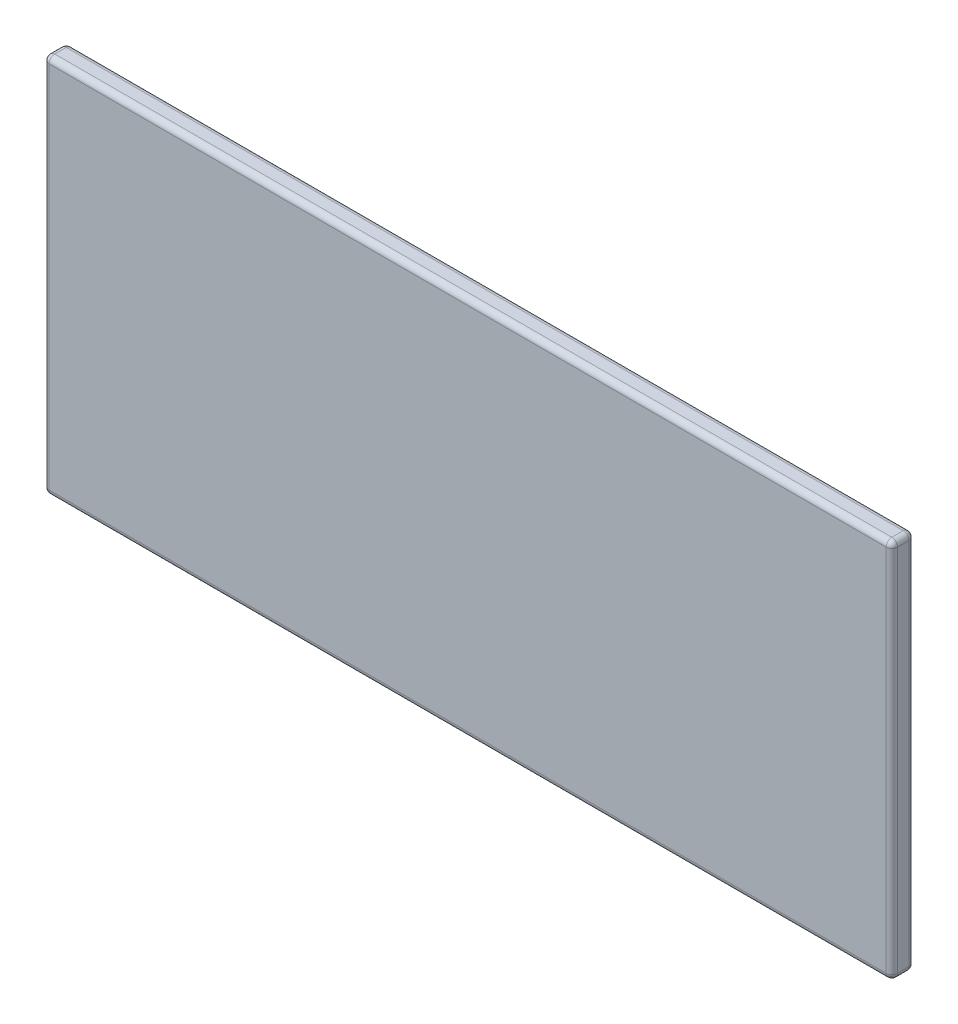
ISO-10303-21;
HEADER;
FILE_DESCRIPTION(('STEP AP214'),'2;1');
FILE_NAME('part.step','',(''),(''),'','','');
FILE_SCHEMA(('AUTOMOTIVE_DESIGN { 1 0 10303 214 1 1 1 1 }'));
ENDSEC;
DATA;
#1=APPLICATION_CONTEXT('core data for automotive mechanical design processes');
#2=APPLICATION_PROTOCOL_DEFINITION('international standard','automotive_design',2000,#1);
#3=PRODUCT_CONTEXT('',#1,'mechanical');
#4=PRODUCT('Part','Part','',(#3));
#5=PRODUCT_RELATED_PRODUCT_CATEGORY('part','',(#4));
#6=PRODUCT_DEFINITION_FORMATION('','',#4);
#7=PRODUCT_DEFINITION_CONTEXT('part definition',#1,'design');
#8=PRODUCT_DEFINITION('design','',#6,#7);
#9=PRODUCT_DEFINITION_SHAPE('','',#8);
#10=(LENGTH_UNIT() NAMED_UNIT(*) SI_UNIT(.MILLI.,.METRE.));
#11=(NAMED_UNIT(*) PLANE_ANGLE_UNIT() SI_UNIT($,.RADIAN.));
#12=(NAMED_UNIT(*) SI_UNIT($,.STERADIAN.) SOLID_ANGLE_UNIT());
#13=UNCERTAINTY_MEASURE_WITH_UNIT(LENGTH_MEASURE(1.E-05),#10,'distance_accuracy_value','');
#14=(GEOMETRIC_REPRESENTATION_CONTEXT(3) GLOBAL_UNCERTAINTY_ASSIGNED_CONTEXT((#13)) GLOBAL_UNIT_ASSIGNED_CONTEXT((#10,
#11,#12)) REPRESENTATION_CONTEXT('',''));
#15=CARTESIAN_POINT('',(0.,0.,0.));
#16=DIRECTION('',(0.,0.,1.));
#17=DIRECTION('',(1.,0.,0.));
#18=AXIS2_PLACEMENT_3D('',#15,#16,#17);
#19=CARTESIAN_POINT('',(37.35,-16.75,2.));
#20=DIRECTION('',(-1.,0.,0.));
#21=DIRECTION('',(0.,0.,1.));
#22=AXIS2_PLACEMENT_3D('',#19,#20,#21);
#23=PLANE('',#22);
#24=DIRECTION('',(0.,1.,0.));
#25=VECTOR('',#24,1.);
#26=CARTESIAN_POINT('',(37.35,-16.75,1.5));
#27=LINE('',#26,#25);
#28=CARTESIAN_POINT('',(37.35,16.25,1.5));
#29=VERTEX_POINT('',#28);
#30=CARTESIAN_POINT('',(37.35,-16.25,1.5));
#31=VERTEX_POINT('',#30);
#32=EDGE_CURVE('E42',#29,#31,#27,.F.);
#33=ORIENTED_EDGE('',*,*,#32,.T.);
#34=DIRECTION('',(0.,0.,-1.));
#35=VECTOR('',#34,1.);
#36=CARTESIAN_POINT('',(37.35,-16.25,2.));
#37=LINE('',#36,#35);
#38=CARTESIAN_POINT('',(37.35,-16.25,0.5));
#39=VERTEX_POINT('',#38);
#40=EDGE_CURVE('E11',#31,#39,#37,.T.);
#41=ORIENTED_EDGE('',*,*,#40,.T.);
#42=DIRECTION('',(0.,1.,0.));
#43=VECTOR('',#42,1.);
#44=CARTESIAN_POINT('',(37.35,16.75,0.5));
#45=LINE('',#44,#43);
#46=CARTESIAN_POINT('',(37.35,16.25,0.5));
#47=VERTEX_POINT('',#46);
#48=EDGE_CURVE('E194',#39,#47,#45,.T.);
#49=ORIENTED_EDGE('',*,*,#48,.T.);
#50=DIRECTION('',(0.,0.,-1.));
#51=VECTOR('',#50,1.);
#52=CARTESIAN_POINT('',(37.35,16.25,2.));
#53=LINE('',#52,#51);
#54=EDGE_CURVE('E53',#47,#29,#53,.F.);
#55=ORIENTED_EDGE('',*,*,#54,.T.);
#56=EDGE_LOOP('',(#33,#41,#49,#55));
#57=FACE_BOUND('',#56,.T.);
#58=ADVANCED_FACE('F33',(#57),#23,.F.);
#59=CARTESIAN_POINT('',(-37.35,16.75,2.));
#60=DIRECTION('',(0.,-1.,0.));
#61=DIRECTION('',(0.,0.,-1.));
#62=AXIS2_PLACEMENT_3D('',#59,#60,#61);
#63=PLANE('',#62);
#64=DIRECTION('',(0.,0.,-1.));
#65=VECTOR('',#64,1.);
#66=CARTESIAN_POINT('',(-36.85,16.75,2.));
#67=LINE('',#66,#65);
#68=CARTESIAN_POINT('',(-36.85,16.75,0.5));
#69=VERTEX_POINT('',#68);
#70=CARTESIAN_POINT('',(-36.85,16.75,1.5));
#71=VERTEX_POINT('',#70);
#72=EDGE_CURVE('E189',#69,#71,#67,.F.);
#73=ORIENTED_EDGE('',*,*,#72,.T.);
#74=DIRECTION('',(-1.,0.,0.));
#75=VECTOR('',#74,1.);
#76=CARTESIAN_POINT('',(-37.35,16.75,1.5));
#77=LINE('',#76,#75);
#78=CARTESIAN_POINT('',(36.85,16.75,1.5));
#79=VERTEX_POINT('',#78);
#80=EDGE_CURVE('E191',#71,#79,#77,.F.);
#81=ORIENTED_EDGE('',*,*,#80,.T.);
#82=DIRECTION('',(0.,0.,-1.));
#83=VECTOR('',#82,1.);
#84=CARTESIAN_POINT('',(36.85,16.75,2.));
#85=LINE('',#84,#83);
#86=CARTESIAN_POINT('',(36.85,16.75,0.5));
#87=VERTEX_POINT('',#86);
#88=EDGE_CURVE('E185',#79,#87,#85,.T.);
#89=ORIENTED_EDGE('',*,*,#88,.T.);
#90=DIRECTION('',(-1.,0.,0.));
#91=VECTOR('',#90,1.);
#92=CARTESIAN_POINT('',(-37.35,16.75,0.5));
#93=LINE('',#92,#91);
#94=EDGE_CURVE('E187',#87,#69,#93,.T.);
#95=ORIENTED_EDGE('',*,*,#94,.T.);
#96=EDGE_LOOP('',(#73,#81,#89,#95));
#97=FACE_BOUND('',#96,.T.);
#98=ADVANCED_FACE('F278',(#97),#63,.F.);
#99=CARTESIAN_POINT('',(-37.35,-16.75,2.));
#100=DIRECTION('',(1.,0.,0.));
#101=DIRECTION('',(0.,0.,-1.));
#102=AXIS2_PLACEMENT_3D('',#99,#100,#101);
#103=PLANE('',#102);
#104=DIRECTION('',(0.,0.,-1.));
#105=VECTOR('',#104,1.);
#106=CARTESIAN_POINT('',(-37.35,-16.25,2.));
#107=LINE('',#106,#105);
#108=CARTESIAN_POINT('',(-37.35,-16.25,0.5));
#109=VERTEX_POINT('',#108);
#110=CARTESIAN_POINT('',(-37.35,-16.25,1.5));
#111=VERTEX_POINT('',#110);
#112=EDGE_CURVE('E180',#109,#111,#107,.F.);
#113=ORIENTED_EDGE('',*,*,#112,.T.);
#114=DIRECTION('',(0.,-1.,0.));
#115=VECTOR('',#114,1.);
#116=CARTESIAN_POINT('',(-37.35,-16.75,1.5));
#117=LINE('',#116,#115);
#118=CARTESIAN_POINT('',(-37.35,16.25,1.5));
#119=VERTEX_POINT('',#118);
#120=EDGE_CURVE('E182',#111,#119,#117,.F.);
#121=ORIENTED_EDGE('',*,*,#120,.T.);
#122=DIRECTION('',(0.,0.,-1.));
#123=VECTOR('',#122,1.);
#124=CARTESIAN_POINT('',(-37.35,16.25,2.));
#125=LINE('',#124,#123);
#126=CARTESIAN_POINT('',(-37.35,16.25,0.5));
#127=VERTEX_POINT('',#126);
#128=EDGE_CURVE('E176',#119,#127,#125,.T.);
#129=ORIENTED_EDGE('',*,*,#128,.T.);
#130=DIRECTION('',(0.,-1.,0.));
#131=VECTOR('',#130,1.);
#132=CARTESIAN_POINT('',(-37.35,-16.75,0.5));
#133=LINE('',#132,#131);
#134=EDGE_CURVE('E178',#127,#109,#133,.T.);
#135=ORIENTED_EDGE('',*,*,#134,.T.);
#136=EDGE_LOOP('',(#113,#121,#129,#135));
#137=FACE_BOUND('',#136,.T.);
#138=ADVANCED_FACE('F269',(#137),#103,.F.);
#139=CARTESIAN_POINT('',(-37.35,-16.75,2.));
#140=DIRECTION('',(0.,1.,0.));
#141=DIRECTION('',(0.,0.,1.));
#142=AXIS2_PLACEMENT_3D('',#139,#140,#141);
#143=PLANE('',#142);
#144=DIRECTION('',(1.,0.,0.));
#145=VECTOR('',#144,1.);
#146=CARTESIAN_POINT('',(-37.35,-16.75,1.5));
#147=LINE('',#146,#145);
#148=CARTESIAN_POINT('',(36.85,-16.75,1.5));
#149=VERTEX_POINT('',#148);
#150=CARTESIAN_POINT('',(-36.85,-16.75,1.5));
#151=VERTEX_POINT('',#150);
#152=EDGE_CURVE('E129',#149,#151,#147,.F.);
#153=ORIENTED_EDGE('',*,*,#152,.T.);
#154=DIRECTION('',(0.,0.,-1.));
#155=VECTOR('',#154,1.);
#156=CARTESIAN_POINT('',(-36.85,-16.75,2.));
#157=LINE('',#156,#155);
#158=CARTESIAN_POINT('',(-36.85,-16.75,0.5));
#159=VERTEX_POINT('',#158);
#160=EDGE_CURVE('E165',#151,#159,#157,.T.);
#161=ORIENTED_EDGE('',*,*,#160,.T.);
#162=DIRECTION('',(1.,0.,0.));
#163=VECTOR('',#162,1.);
#164=CARTESIAN_POINT('',(37.35,-16.75,0.5));
#165=LINE('',#164,#163);
#166=CARTESIAN_POINT('',(36.85,-16.75,0.5));
#167=VERTEX_POINT('',#166);
#168=EDGE_CURVE('E158',#159,#167,#165,.T.);
#169=ORIENTED_EDGE('',*,*,#168,.T.);
#170=DIRECTION('',(0.,0.,-1.));
#171=VECTOR('',#170,1.);
#172=CARTESIAN_POINT('',(36.85,-16.75,2.));
#173=LINE('',#172,#171);
#174=EDGE_CURVE('E156',#167,#149,#173,.F.);
#175=ORIENTED_EDGE('',*,*,#174,.T.);
#176=EDGE_LOOP('',(#153,#161,#169,#175));
#177=FACE_BOUND('',#176,.T.);
#178=ADVANCED_FACE('F356',(#177),#143,.F.);
#179=CARTESIAN_POINT('',(0.,0.,2.));
#180=DIRECTION('',(0.,0.,-1.));
#181=DIRECTION('',(-1.,0.,0.));
#182=AXIS2_PLACEMENT_3D('',#179,#180,#181);
#183=PLANE('',#182);
#184=DIRECTION('',(0.,-1.,0.));
#185=VECTOR('',#184,1.);
#186=CARTESIAN_POINT('',(-36.85,0.,2.));
#187=LINE('',#186,#185);
#188=CARTESIAN_POINT('',(-36.85,16.25,2.));
#189=VERTEX_POINT('',#188);
#190=CARTESIAN_POINT('',(-36.85,-16.25,2.));
#191=VERTEX_POINT('',#190);
#192=EDGE_CURVE('E154',#189,#191,#187,.T.);
#193=ORIENTED_EDGE('',*,*,#192,.T.);
#194=DIRECTION('',(1.,0.,0.));
#195=VECTOR('',#194,1.);
#196=CARTESIAN_POINT('',(0.,-16.25,2.));
#197=LINE('',#196,#195);
#198=CARTESIAN_POINT('',(36.85,-16.25,2.));
#199=VERTEX_POINT('',#198);
#200=EDGE_CURVE('E127',#191,#199,#197,.T.);
#201=ORIENTED_EDGE('',*,*,#200,.T.);
#202=DIRECTION('',(0.,1.,0.));
#203=VECTOR('',#202,1.);
#204=CARTESIAN_POINT('',(36.85,0.,2.));
#205=LINE('',#204,#203);
#206=CARTESIAN_POINT('',(36.85,16.25,2.));
#207=VERTEX_POINT('',#206);
#208=EDGE_CURVE('E144',#199,#207,#205,.T.);
#209=ORIENTED_EDGE('',*,*,#208,.T.);
#210=DIRECTION('',(-1.,0.,0.));
#211=VECTOR('',#210,1.);
#212=CARTESIAN_POINT('',(0.,16.25,2.));
#213=LINE('',#212,#211);
#214=EDGE_CURVE('E150',#207,#189,#213,.T.);
#215=ORIENTED_EDGE('',*,*,#214,.T.);
#216=EDGE_LOOP('',(#193,#201,#209,#215));
#217=FACE_BOUND('',#216,.T.);
#218=ADVANCED_FACE('F152',(#217),#183,.F.);
#219=CARTESIAN_POINT('',(0.,0.,0.));
#220=DIRECTION('',(0.,0.,-1.));
#221=DIRECTION('',(-1.,0.,0.));
#222=AXIS2_PLACEMENT_3D('',#219,#220,#221);
#223=PLANE('',#222);
#224=DIRECTION('',(0.,1.,0.));
#225=VECTOR('',#224,1.);
#226=CARTESIAN_POINT('',(36.85,-16.75,0.));
#227=LINE('',#226,#225);
#228=CARTESIAN_POINT('',(36.85,16.25,0.));
#229=VERTEX_POINT('',#228);
#230=CARTESIAN_POINT('',(36.85,-16.25,0.));
#231=VERTEX_POINT('',#230);
#232=EDGE_CURVE('E167',#229,#231,#227,.F.);
#233=ORIENTED_EDGE('',*,*,#232,.T.);
#234=DIRECTION('',(1.,0.,0.));
#235=VECTOR('',#234,1.);
#236=CARTESIAN_POINT('',(-37.35,-16.25,0.));
#237=LINE('',#236,#235);
#238=CARTESIAN_POINT('',(-36.85,-16.25,0.));
#239=VERTEX_POINT('',#238);
#240=EDGE_CURVE('E173',#231,#239,#237,.F.);
#241=ORIENTED_EDGE('',*,*,#240,.T.);
#242=DIRECTION('',(0.,-1.,0.));
#243=VECTOR('',#242,1.);
#244=CARTESIAN_POINT('',(-36.85,16.75,0.));
#245=LINE('',#244,#243);
#246=CARTESIAN_POINT('',(-36.85,16.25,0.));
#247=VERTEX_POINT('',#246);
#248=EDGE_CURVE('E171',#239,#247,#245,.F.);
#249=ORIENTED_EDGE('',*,*,#248,.T.);
#250=DIRECTION('',(-1.,0.,0.));
#251=VECTOR('',#250,1.);
#252=CARTESIAN_POINT('',(37.35,16.25,0.));
#253=LINE('',#252,#251);
#254=EDGE_CURVE('E169',#247,#229,#253,.F.);
#255=ORIENTED_EDGE('',*,*,#254,.T.);
#256=EDGE_LOOP('',(#233,#241,#249,#255));
#257=FACE_BOUND('',#256,.T.);
#258=ADVANCED_FACE('F296',(#257),#223,.T.);
#259=CARTESIAN_POINT('',(-37.35,16.25,0.5));
#260=DIRECTION('',(1.,0.,0.));
#261=DIRECTION('',(0.,0.,-1.));
#262=AXIS2_PLACEMENT_3D('',#259,#260,#261);
#263=CYLINDRICAL_SURFACE('',#262,0.5);
#264=CARTESIAN_POINT('',(-36.85,16.25,0.5));
#265=DIRECTION('',(-1.,0.,0.));
#266=DIRECTION('',(0.,0.,1.));
#267=AXIS2_PLACEMENT_3D('',#264,#265,#266);
#268=CIRCLE('',#267,0.5);
#269=EDGE_CURVE('E37',#69,#247,#268,.T.);
#270=ORIENTED_EDGE('',*,*,#269,.F.);
#271=ORIENTED_EDGE('',*,*,#94,.F.);
#272=CARTESIAN_POINT('',(36.85,16.25,0.5));
#273=DIRECTION('',(1.,0.,0.));
#274=DIRECTION('',(0.,0.,-1.));
#275=AXIS2_PLACEMENT_3D('',#272,#273,#274);
#276=CIRCLE('',#275,0.5);
#277=EDGE_CURVE('E246',#229,#87,#276,.T.);
#278=ORIENTED_EDGE('',*,*,#277,.F.);
#279=ORIENTED_EDGE('',*,*,#254,.F.);
#280=EDGE_LOOP('',(#270,#271,#278,#279));
#281=FACE_BOUND('',#280,.T.);
#282=ADVANCED_FACE('F35',(#281),#263,.T.);
#283=CARTESIAN_POINT('',(-36.85,16.25,0.5));
#284=DIRECTION('',(0.,0.,1.));
#285=DIRECTION('',(1.,0.,0.));
#286=AXIS2_PLACEMENT_3D('',#283,#284,#285);
#287=SPHERICAL_SURFACE('',#286,0.5);
#288=CARTESIAN_POINT('',(-36.85,16.25,0.5));
#289=DIRECTION('',(0.,0.,-1.));
#290=DIRECTION('',(-1.,0.,0.));
#291=AXIS2_PLACEMENT_3D('',#288,#289,#290);
#292=CIRCLE('',#291,0.5);
#293=EDGE_CURVE('E241',#69,#127,#292,.F.);
#294=ORIENTED_EDGE('',*,*,#293,.F.);
#295=ORIENTED_EDGE('',*,*,#269,.T.);
#296=CARTESIAN_POINT('',(-36.85,16.25,0.5));
#297=DIRECTION('',(0.,1.,0.));
#298=DIRECTION('',(0.,0.,1.));
#299=AXIS2_PLACEMENT_3D('',#296,#297,#298);
#300=CIRCLE('',#299,0.5);
#301=EDGE_CURVE('E244',#127,#247,#300,.F.);
#302=ORIENTED_EDGE('',*,*,#301,.F.);
#303=EDGE_LOOP('',(#294,#295,#302));
#304=FACE_BOUND('',#303,.T.);
#305=ADVANCED_FACE('F257',(#304),#287,.T.);
#306=CARTESIAN_POINT('',(36.85,16.25,0.5));
#307=DIRECTION('',(0.,0.,1.));
#308=DIRECTION('',(1.,0.,0.));
#309=AXIS2_PLACEMENT_3D('',#306,#307,#308);
#310=SPHERICAL_SURFACE('',#309,0.5);
#311=CARTESIAN_POINT('',(36.85,16.25,0.5));
#312=DIRECTION('',(0.,1.,0.));
#313=DIRECTION('',(0.,0.,1.));
#314=AXIS2_PLACEMENT_3D('',#311,#312,#313);
#315=CIRCLE('',#314,0.5);
#316=EDGE_CURVE('E235',#229,#47,#315,.F.);
#317=ORIENTED_EDGE('',*,*,#316,.F.);
#318=ORIENTED_EDGE('',*,*,#277,.T.);
#319=CARTESIAN_POINT('',(36.85,16.25,0.5));
#320=DIRECTION('',(0.,0.,-1.));
#321=DIRECTION('',(-1.,0.,0.));
#322=AXIS2_PLACEMENT_3D('',#319,#320,#321);
#323=CIRCLE('',#322,0.5);
#324=EDGE_CURVE('E238',#47,#87,#323,.F.);
#325=ORIENTED_EDGE('',*,*,#324,.F.);
#326=EDGE_LOOP('',(#317,#318,#325));
#327=FACE_BOUND('',#326,.T.);
#328=ADVANCED_FACE('F289',(#327),#310,.T.);
#329=CARTESIAN_POINT('',(-36.85,-16.75,0.5));
#330=DIRECTION('',(0.,1.,0.));
#331=DIRECTION('',(0.,0.,1.));
#332=AXIS2_PLACEMENT_3D('',#329,#330,#331);
#333=CYLINDRICAL_SURFACE('',#332,0.5);
#334=ORIENTED_EDGE('',*,*,#301,.T.);
#335=ORIENTED_EDGE('',*,*,#248,.F.);
#336=CARTESIAN_POINT('',(-36.85,-16.25,0.5));
#337=DIRECTION('',(0.,-1.,0.));
#338=DIRECTION('',(0.,0.,-1.));
#339=AXIS2_PLACEMENT_3D('',#336,#337,#338);
#340=CIRCLE('',#339,0.5);
#341=EDGE_CURVE('E230',#109,#239,#340,.T.);
#342=ORIENTED_EDGE('',*,*,#341,.F.);
#343=ORIENTED_EDGE('',*,*,#134,.F.);
#344=EDGE_LOOP('',(#334,#335,#342,#343));
#345=FACE_BOUND('',#344,.T.);
#346=ADVANCED_FACE('F265',(#345),#333,.T.);
#347=CARTESIAN_POINT('',(-36.85,16.25,2.));
#348=DIRECTION('',(0.,0.,-1.));
#349=DIRECTION('',(-1.,0.,0.));
#350=AXIS2_PLACEMENT_3D('',#347,#348,#349);
#351=CYLINDRICAL_SURFACE('',#350,0.5);
#352=ORIENTED_EDGE('',*,*,#293,.T.);
#353=ORIENTED_EDGE('',*,*,#128,.F.);
#354=CARTESIAN_POINT('',(-36.85,16.25,1.5));
#355=DIRECTION('',(0.,0.,1.));
#356=DIRECTION('',(1.,0.,0.));
#357=AXIS2_PLACEMENT_3D('',#354,#355,#356);
#358=CIRCLE('',#357,0.5);
#359=EDGE_CURVE('E227',#71,#119,#358,.T.);
#360=ORIENTED_EDGE('',*,*,#359,.F.);
#361=ORIENTED_EDGE('',*,*,#72,.F.);
#362=EDGE_LOOP('',(#352,#353,#360,#361));
#363=FACE_BOUND('',#362,.T.);
#364=ADVANCED_FACE('F275',(#363),#351,.T.);
#365=CARTESIAN_POINT('',(0.,16.25,1.5));
#366=DIRECTION('',(-1.,0.,0.));
#367=DIRECTION('',(0.,0.,1.));
#368=AXIS2_PLACEMENT_3D('',#365,#366,#367);
#369=CYLINDRICAL_SURFACE('',#368,0.5);
#370=CARTESIAN_POINT('',(36.85,16.25,1.5));
#371=DIRECTION('',(1.,0.,0.));
#372=DIRECTION('',(0.,0.,-1.));
#373=AXIS2_PLACEMENT_3D('',#370,#371,#372);
#374=CIRCLE('',#373,0.5);
#375=EDGE_CURVE('E221',#79,#207,#374,.T.);
#376=ORIENTED_EDGE('',*,*,#375,.F.);
#377=ORIENTED_EDGE('',*,*,#80,.F.);
#378=CARTESIAN_POINT('',(-36.85,16.25,1.5));
#379=DIRECTION('',(-1.,0.,0.));
#380=DIRECTION('',(0.,0.,1.));
#381=AXIS2_PLACEMENT_3D('',#378,#379,#380);
#382=CIRCLE('',#381,0.5);
#383=EDGE_CURVE('E224',#189,#71,#382,.T.);
#384=ORIENTED_EDGE('',*,*,#383,.F.);
#385=ORIENTED_EDGE('',*,*,#214,.F.);
#386=EDGE_LOOP('',(#376,#377,#384,#385));
#387=FACE_BOUND('',#386,.T.);
#388=ADVANCED_FACE('F282',(#387),#369,.T.);
#389=CARTESIAN_POINT('',(36.85,16.25,2.));
#390=DIRECTION('',(0.,0.,-1.));
#391=DIRECTION('',(-1.,0.,0.));
#392=AXIS2_PLACEMENT_3D('',#389,#390,#391);
#393=CYLINDRICAL_SURFACE('',#392,0.5);
#394=ORIENTED_EDGE('',*,*,#324,.T.);
#395=ORIENTED_EDGE('',*,*,#88,.F.);
#396=CARTESIAN_POINT('',(36.85,16.25,1.5));
#397=DIRECTION('',(0.,0.,1.));
#398=DIRECTION('',(1.,0.,0.));
#399=AXIS2_PLACEMENT_3D('',#396,#397,#398);
#400=CIRCLE('',#399,0.5);
#401=EDGE_CURVE('E219',#29,#79,#400,.T.);
#402=ORIENTED_EDGE('',*,*,#401,.F.);
#403=ORIENTED_EDGE('',*,*,#54,.F.);
#404=EDGE_LOOP('',(#394,#395,#402,#403));
#405=FACE_BOUND('',#404,.T.);
#406=ADVANCED_FACE('F287',(#405),#393,.T.);
#407=CARTESIAN_POINT('',(36.85,-16.75,0.5));
#408=DIRECTION('',(0.,-1.,0.));
#409=DIRECTION('',(0.,0.,-1.));
#410=AXIS2_PLACEMENT_3D('',#407,#408,#409);
#411=CYLINDRICAL_SURFACE('',#410,0.5);
#412=ORIENTED_EDGE('',*,*,#316,.T.);
#413=ORIENTED_EDGE('',*,*,#48,.F.);
#414=CARTESIAN_POINT('',(36.85,-16.25,0.5));
#415=DIRECTION('',(0.,-1.,0.));
#416=DIRECTION('',(0.,0.,-1.));
#417=AXIS2_PLACEMENT_3D('',#414,#415,#416);
#418=CIRCLE('',#417,0.5);
#419=EDGE_CURVE('E216',#231,#39,#418,.T.);
#420=ORIENTED_EDGE('',*,*,#419,.F.);
#421=ORIENTED_EDGE('',*,*,#232,.F.);
#422=EDGE_LOOP('',(#412,#413,#420,#421));
#423=FACE_BOUND('',#422,.T.);
#424=ADVANCED_FACE('F293',(#423),#411,.T.);
#425=CARTESIAN_POINT('',(-37.35,-16.25,0.5));
#426=DIRECTION('',(-1.,0.,0.));
#427=DIRECTION('',(0.,0.,1.));
#428=AXIS2_PLACEMENT_3D('',#425,#426,#427);
#429=CYLINDRICAL_SURFACE('',#428,0.5);
#430=CARTESIAN_POINT('',(-36.85,-16.25,0.5));
#431=DIRECTION('',(-1.,0.,0.));
#432=DIRECTION('',(0.,0.,1.));
#433=AXIS2_PLACEMENT_3D('',#430,#431,#432);
#434=CIRCLE('',#433,0.5);
#435=EDGE_CURVE('E232',#239,#159,#434,.T.);
#436=ORIENTED_EDGE('',*,*,#435,.F.);
#437=ORIENTED_EDGE('',*,*,#240,.F.);
#438=CARTESIAN_POINT('',(36.85,-16.25,0.5));
#439=DIRECTION('',(1.,0.,0.));
#440=DIRECTION('',(0.,0.,-1.));
#441=AXIS2_PLACEMENT_3D('',#438,#439,#440);
#442=CIRCLE('',#441,0.5);
#443=EDGE_CURVE('E213',#167,#231,#442,.T.);
#444=ORIENTED_EDGE('',*,*,#443,.F.);
#445=ORIENTED_EDGE('',*,*,#168,.F.);
#446=EDGE_LOOP('',(#436,#437,#444,#445));
#447=FACE_BOUND('',#446,.T.);
#448=ADVANCED_FACE('F300',(#447),#429,.T.);
#449=CARTESIAN_POINT('',(-36.85,-16.25,0.5));
#450=DIRECTION('',(0.,0.,1.));
#451=DIRECTION('',(1.,0.,0.));
#452=AXIS2_PLACEMENT_3D('',#449,#450,#451);
#453=SPHERICAL_SURFACE('',#452,0.5);
#454=ORIENTED_EDGE('',*,*,#341,.T.);
#455=ORIENTED_EDGE('',*,*,#435,.T.);
#456=CARTESIAN_POINT('',(-36.85,-16.25,0.5));
#457=DIRECTION('',(0.,0.,-1.));
#458=DIRECTION('',(-1.,0.,0.));
#459=AXIS2_PLACEMENT_3D('',#456,#457,#458);
#460=CIRCLE('',#459,0.5);
#461=EDGE_CURVE('E210',#109,#159,#460,.F.);
#462=ORIENTED_EDGE('',*,*,#461,.F.);
#463=EDGE_LOOP('',(#454,#455,#462));
#464=FACE_BOUND('',#463,.T.);
#465=ADVANCED_FACE('F304',(#464),#453,.T.);
#466=CARTESIAN_POINT('',(-36.85,16.25,1.5));
#467=DIRECTION('',(0.,0.,1.));
#468=DIRECTION('',(1.,0.,0.));
#469=AXIS2_PLACEMENT_3D('',#466,#467,#468);
#470=SPHERICAL_SURFACE('',#469,0.5);
#471=ORIENTED_EDGE('',*,*,#383,.T.);
#472=ORIENTED_EDGE('',*,*,#359,.T.);
#473=CARTESIAN_POINT('',(-36.85,16.25,1.5));
#474=DIRECTION('',(0.,1.,0.));
#475=DIRECTION('',(0.,0.,1.));
#476=AXIS2_PLACEMENT_3D('',#473,#474,#475);
#477=CIRCLE('',#476,0.5);
#478=EDGE_CURVE('E208',#189,#119,#477,.F.);
#479=ORIENTED_EDGE('',*,*,#478,.F.);
#480=EDGE_LOOP('',(#471,#472,#479));
#481=FACE_BOUND('',#480,.T.);
#482=ADVANCED_FACE('F315',(#481),#470,.T.);
#483=CARTESIAN_POINT('',(36.85,16.25,1.5));
#484=DIRECTION('',(0.,0.,1.));
#485=DIRECTION('',(1.,0.,0.));
#486=AXIS2_PLACEMENT_3D('',#483,#484,#485);
#487=SPHERICAL_SURFACE('',#486,0.5);
#488=ORIENTED_EDGE('',*,*,#401,.T.);
#489=ORIENTED_EDGE('',*,*,#375,.T.);
#490=CARTESIAN_POINT('',(36.85,16.25,1.5));
#491=DIRECTION('',(0.,1.,0.));
#492=DIRECTION('',(0.,0.,1.));
#493=AXIS2_PLACEMENT_3D('',#490,#491,#492);
#494=CIRCLE('',#493,0.5);
#495=EDGE_CURVE('E147',#29,#207,#494,.F.);
#496=ORIENTED_EDGE('',*,*,#495,.F.);
#497=EDGE_LOOP('',(#488,#489,#496));
#498=FACE_BOUND('',#497,.T.);
#499=ADVANCED_FACE('F317',(#498),#487,.T.);
#500=CARTESIAN_POINT('',(36.85,-16.25,0.5));
#501=DIRECTION('',(0.,0.,1.));
#502=DIRECTION('',(1.,0.,0.));
#503=AXIS2_PLACEMENT_3D('',#500,#501,#502);
#504=SPHERICAL_SURFACE('',#503,0.5);
#505=ORIENTED_EDGE('',*,*,#443,.T.);
#506=ORIENTED_EDGE('',*,*,#419,.T.);
#507=CARTESIAN_POINT('',(36.85,-16.25,0.5));
#508=DIRECTION('',(0.,0.,-1.));
#509=DIRECTION('',(-1.,0.,0.));
#510=AXIS2_PLACEMENT_3D('',#507,#508,#509);
#511=CIRCLE('',#510,0.5);
#512=EDGE_CURVE('E205',#167,#39,#511,.F.);
#513=ORIENTED_EDGE('',*,*,#512,.F.);
#514=EDGE_LOOP('',(#505,#506,#513));
#515=FACE_BOUND('',#514,.T.);
#516=ADVANCED_FACE('F323',(#515),#504,.T.);
#517=CARTESIAN_POINT('',(-36.85,-16.25,2.));
#518=DIRECTION('',(0.,0.,-1.));
#519=DIRECTION('',(-1.,0.,0.));
#520=AXIS2_PLACEMENT_3D('',#517,#518,#519);
#521=CYLINDRICAL_SURFACE('',#520,0.5);
#522=ORIENTED_EDGE('',*,*,#461,.T.);
#523=ORIENTED_EDGE('',*,*,#160,.F.);
#524=CARTESIAN_POINT('',(-36.85,-16.25,1.5));
#525=DIRECTION('',(0.,0.,1.));
#526=DIRECTION('',(1.,0.,0.));
#527=AXIS2_PLACEMENT_3D('',#524,#525,#526);
#528=CIRCLE('',#527,0.5);
#529=EDGE_CURVE('E202',#111,#151,#528,.T.);
#530=ORIENTED_EDGE('',*,*,#529,.F.);
#531=ORIENTED_EDGE('',*,*,#112,.F.);
#532=EDGE_LOOP('',(#522,#523,#530,#531));
#533=FACE_BOUND('',#532,.T.);
#534=ADVANCED_FACE('F307',(#533),#521,.T.);
#535=CARTESIAN_POINT('',(-36.85,0.,1.5));
#536=DIRECTION('',(0.,-1.,0.));
#537=DIRECTION('',(0.,0.,-1.));
#538=AXIS2_PLACEMENT_3D('',#535,#536,#537);
#539=CYLINDRICAL_SURFACE('',#538,0.5);
#540=ORIENTED_EDGE('',*,*,#478,.T.);
#541=ORIENTED_EDGE('',*,*,#120,.F.);
#542=CARTESIAN_POINT('',(-36.85,-16.25,1.5));
#543=DIRECTION('',(0.,-1.,0.));
#544=DIRECTION('',(0.,0.,-1.));
#545=AXIS2_PLACEMENT_3D('',#542,#543,#544);
#546=CIRCLE('',#545,0.5);
#547=EDGE_CURVE('E141',#191,#111,#546,.T.);
#548=ORIENTED_EDGE('',*,*,#547,.F.);
#549=ORIENTED_EDGE('',*,*,#192,.F.);
#550=EDGE_LOOP('',(#540,#541,#548,#549));
#551=FACE_BOUND('',#550,.T.);
#552=ADVANCED_FACE('F313',(#551),#539,.T.);
#553=CARTESIAN_POINT('',(36.85,0.,1.5));
#554=DIRECTION('',(0.,1.,0.));
#555=DIRECTION('',(0.,0.,1.));
#556=AXIS2_PLACEMENT_3D('',#553,#554,#555);
#557=CYLINDRICAL_SURFACE('',#556,0.5);
#558=ORIENTED_EDGE('',*,*,#495,.T.);
#559=ORIENTED_EDGE('',*,*,#208,.F.);
#560=CARTESIAN_POINT('',(36.85,-16.25,1.5));
#561=DIRECTION('',(0.,-1.,0.));
#562=DIRECTION('',(0.,0.,-1.));
#563=AXIS2_PLACEMENT_3D('',#560,#561,#562);
#564=CIRCLE('',#563,0.5);
#565=EDGE_CURVE('E135',#31,#199,#564,.T.);
#566=ORIENTED_EDGE('',*,*,#565,.F.);
#567=ORIENTED_EDGE('',*,*,#32,.F.);
#568=EDGE_LOOP('',(#558,#559,#566,#567));
#569=FACE_BOUND('',#568,.T.);
#570=ADVANCED_FACE('F145',(#569),#557,.T.);
#571=CARTESIAN_POINT('',(36.85,-16.25,2.));
#572=DIRECTION('',(0.,0.,-1.));
#573=DIRECTION('',(-1.,0.,0.));
#574=AXIS2_PLACEMENT_3D('',#571,#572,#573);
#575=CYLINDRICAL_SURFACE('',#574,0.5);
#576=ORIENTED_EDGE('',*,*,#512,.T.);
#577=ORIENTED_EDGE('',*,*,#40,.F.);
#578=CARTESIAN_POINT('',(36.85,-16.25,1.5));
#579=DIRECTION('',(0.,0.,1.));
#580=DIRECTION('',(1.,0.,0.));
#581=AXIS2_PLACEMENT_3D('',#578,#579,#580);
#582=CIRCLE('',#581,0.5);
#583=EDGE_CURVE('E139',#149,#31,#582,.T.);
#584=ORIENTED_EDGE('',*,*,#583,.F.);
#585=ORIENTED_EDGE('',*,*,#174,.F.);
#586=EDGE_LOOP('',(#576,#577,#584,#585));
#587=FACE_BOUND('',#586,.T.);
#588=ADVANCED_FACE('F340',(#587),#575,.T.);
#589=CARTESIAN_POINT('',(-36.85,-16.25,1.5));
#590=DIRECTION('',(0.,0.,1.));
#591=DIRECTION('',(1.,0.,0.));
#592=AXIS2_PLACEMENT_3D('',#589,#590,#591);
#593=SPHERICAL_SURFACE('',#592,0.5);
#594=ORIENTED_EDGE('',*,*,#547,.T.);
#595=ORIENTED_EDGE('',*,*,#529,.T.);
#596=CARTESIAN_POINT('',(-36.85,-16.25,1.5));
#597=DIRECTION('',(-1.,0.,0.));
#598=DIRECTION('',(0.,0.,1.));
#599=AXIS2_PLACEMENT_3D('',#596,#597,#598);
#600=CIRCLE('',#599,0.5);
#601=EDGE_CURVE('E132',#191,#151,#600,.F.);
#602=ORIENTED_EDGE('',*,*,#601,.F.);
#603=EDGE_LOOP('',(#594,#595,#602));
#604=FACE_BOUND('',#603,.T.);
#605=ADVANCED_FACE('F311',(#604),#593,.T.);
#606=CARTESIAN_POINT('',(36.85,-16.25,1.5));
#607=DIRECTION('',(0.,0.,1.));
#608=DIRECTION('',(1.,0.,0.));
#609=AXIS2_PLACEMENT_3D('',#606,#607,#608);
#610=SPHERICAL_SURFACE('',#609,0.5);
#611=ORIENTED_EDGE('',*,*,#583,.T.);
#612=ORIENTED_EDGE('',*,*,#565,.T.);
#613=CARTESIAN_POINT('',(36.85,-16.25,1.5));
#614=DIRECTION('',(1.,0.,0.));
#615=DIRECTION('',(0.,0.,-1.));
#616=AXIS2_PLACEMENT_3D('',#613,#614,#615);
#617=CIRCLE('',#616,0.5);
#618=EDGE_CURVE('E123',#149,#199,#617,.F.);
#619=ORIENTED_EDGE('',*,*,#618,.F.);
#620=EDGE_LOOP('',(#611,#612,#619));
#621=FACE_BOUND('',#620,.T.);
#622=ADVANCED_FACE('F137',(#621),#610,.T.);
#623=CARTESIAN_POINT('',(0.,-16.25,1.5));
#624=DIRECTION('',(1.,0.,0.));
#625=DIRECTION('',(0.,0.,-1.));
#626=AXIS2_PLACEMENT_3D('',#623,#624,#625);
#627=CYLINDRICAL_SURFACE('',#626,0.5);
#628=ORIENTED_EDGE('',*,*,#601,.T.);
#629=ORIENTED_EDGE('',*,*,#152,.F.);
#630=ORIENTED_EDGE('',*,*,#618,.T.);
#631=ORIENTED_EDGE('',*,*,#200,.F.);
#632=EDGE_LOOP('',(#628,#629,#630,#631));
#633=FACE_BOUND('',#632,.T.);
#634=ADVANCED_FACE('F125',(#633),#627,.T.);
#635=CLOSED_SHELL('',(#58,#98,#138,#178,#218,#258,#282,#305,#328,#346,#364,#388,#406,#424,#448,
#465,#482,#499,#516,#534,#552,#570,#588,#605,#622,#634));
#636=MANIFOLD_SOLID_BREP('B2',#635);
#637=ADVANCED_BREP_SHAPE_REPRESENTATION('',(#18,#636),#14);
#638=SHAPE_DEFINITION_REPRESENTATION(#9,#637);
ENDSEC;
END-ISO-10303-21;
